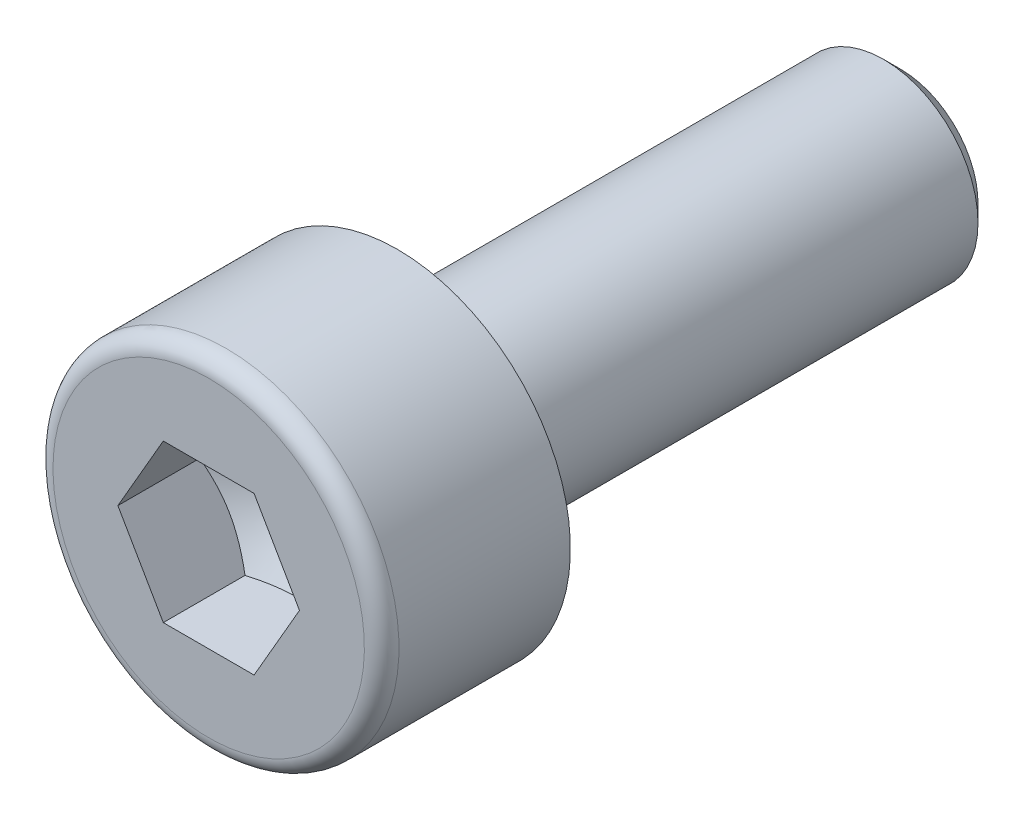
ISO-10303-21;
HEADER;
FILE_DESCRIPTION(('STEP AP214'),'2;1');
FILE_NAME('part.step','',(''),(''),'','','');
FILE_SCHEMA(('AUTOMOTIVE_DESIGN { 1 0 10303 214 1 1 1 1 }'));
ENDSEC;
DATA;
#1=APPLICATION_CONTEXT('core data for automotive mechanical design processes');
#2=APPLICATION_PROTOCOL_DEFINITION('international standard','automotive_design',2000,#1);
#3=PRODUCT_CONTEXT('',#1,'mechanical');
#4=PRODUCT('Part','Part','',(#3));
#5=PRODUCT_RELATED_PRODUCT_CATEGORY('part','',(#4));
#6=PRODUCT_DEFINITION_FORMATION('','',#4);
#7=PRODUCT_DEFINITION_CONTEXT('part definition',#1,'design');
#8=PRODUCT_DEFINITION('design','',#6,#7);
#9=PRODUCT_DEFINITION_SHAPE('','',#8);
#10=(LENGTH_UNIT() NAMED_UNIT(*) SI_UNIT(.MILLI.,.METRE.));
#11=(NAMED_UNIT(*) PLANE_ANGLE_UNIT() SI_UNIT($,.RADIAN.));
#12=(NAMED_UNIT(*) SI_UNIT($,.STERADIAN.) SOLID_ANGLE_UNIT());
#13=UNCERTAINTY_MEASURE_WITH_UNIT(LENGTH_MEASURE(1.E-05),#10,'distance_accuracy_value','');
#14=(GEOMETRIC_REPRESENTATION_CONTEXT(3) GLOBAL_UNCERTAINTY_ASSIGNED_CONTEXT((#13)) GLOBAL_UNIT_ASSIGNED_CONTEXT((#10,
#11,#12)) REPRESENTATION_CONTEXT('',''));
#15=CARTESIAN_POINT('',(0.,0.,0.));
#16=DIRECTION('',(0.,0.,1.));
#17=DIRECTION('',(1.,0.,0.));
#18=AXIS2_PLACEMENT_3D('',#15,#16,#17);
#19=CARTESIAN_POINT('',(0.,1.375,0.));
#20=DIRECTION('',(0.,0.,-1.));
#21=DIRECTION('',(0.,1.,0.));
#22=AXIS2_PLACEMENT_3D('',#19,#20,#21);
#23=PLANE('',#22);
#24=CARTESIAN_POINT('',(0.,0.,0.));
#25=DIRECTION('',(0.,0.,-1.));
#26=DIRECTION('',(0.,1.,0.));
#27=AXIS2_PLACEMENT_3D('',#24,#25,#26);
#28=CIRCLE('',#27,2.75);
#29=CARTESIAN_POINT('',(0.,2.75,0.));
#30=VERTEX_POINT('',#29);
#31=EDGE_CURVE('E11',#30,#30,#28,.T.);
#32=ORIENTED_EDGE('',*,*,#31,.T.);
#33=EDGE_LOOP('',(#32));
#34=FACE_BOUND('',#33,.T.);
#35=CARTESIAN_POINT('',(0.,0.,0.));
#36=DIRECTION('',(0.,0.,1.));
#37=DIRECTION('',(0.,1.,0.));
#38=AXIS2_PLACEMENT_3D('',#35,#36,#37);
#39=CIRCLE('',#38,1.5);
#40=CARTESIAN_POINT('',(0.,-1.5,0.));
#41=VERTEX_POINT('',#40);
#42=EDGE_CURVE('E173',#41,#41,#39,.T.);
#43=ORIENTED_EDGE('',*,*,#42,.T.);
#44=EDGE_LOOP('',(#43));
#45=FACE_BOUND('',#44,.T.);
#46=ADVANCED_FACE('F16',(#34,#45),#23,.T.);
#47=CARTESIAN_POINT('',(0.,0.,1.3625));
#48=DIRECTION('',(0.,0.,1.));
#49=DIRECTION('',(0.,1.,0.));
#50=AXIS2_PLACEMENT_3D('',#47,#48,#49);
#51=CYLINDRICAL_SURFACE('',#50,2.75);
#52=CARTESIAN_POINT('',(0.,0.,2.725));
#53=DIRECTION('',(0.,0.,-1.));
#54=DIRECTION('',(0.,1.,0.));
#55=AXIS2_PLACEMENT_3D('',#52,#53,#54);
#56=CIRCLE('',#55,2.75);
#57=CARTESIAN_POINT('',(0.,2.75,2.725));
#58=VERTEX_POINT('',#57);
#59=EDGE_CURVE('E28',#58,#58,#56,.T.);
#60=ORIENTED_EDGE('',*,*,#59,.T.);
#61=EDGE_LOOP('',(#60));
#62=FACE_BOUND('',#61,.T.);
#63=ORIENTED_EDGE('',*,*,#31,.F.);
#64=EDGE_LOOP('',(#63));
#65=FACE_BOUND('',#64,.T.);
#66=ADVANCED_FACE('F208',(#62,#65),#51,.T.);
#67=CARTESIAN_POINT('',(0.,0.,2.725));
#68=DIRECTION('',(0.,0.,-1.));
#69=DIRECTION('',(-1.,0.,0.));
#70=AXIS2_PLACEMENT_3D('',#67,#68,#69);
#71=TOROIDAL_SURFACE('',#70,2.475,0.275);
#72=CARTESIAN_POINT('',(0.,0.,3.));
#73=DIRECTION('',(0.,0.,-1.));
#74=DIRECTION('',(0.,1.,0.));
#75=AXIS2_PLACEMENT_3D('',#72,#73,#74);
#76=CIRCLE('',#75,2.475);
#77=CARTESIAN_POINT('',(0.,2.475,3.));
#78=VERTEX_POINT('',#77);
#79=EDGE_CURVE('E151',#78,#78,#76,.T.);
#80=ORIENTED_EDGE('',*,*,#79,.T.);
#81=EDGE_LOOP('',(#80));
#82=FACE_BOUND('',#81,.T.);
#83=ORIENTED_EDGE('',*,*,#59,.F.);
#84=EDGE_LOOP('',(#83));
#85=FACE_BOUND('',#84,.T.);
#86=ADVANCED_FACE('F212',(#82,#85),#71,.T.);
#87=CARTESIAN_POINT('',(0.,1.2375,3.));
#88=DIRECTION('',(0.,0.,1.));
#89=DIRECTION('',(0.,-1.,0.));
#90=AXIS2_PLACEMENT_3D('',#87,#88,#89);
#91=PLANE('',#90);
#92=ORIENTED_EDGE('',*,*,#79,.F.);
#93=EDGE_LOOP('',(#92));
#94=FACE_BOUND('',#93,.T.);
#95=DIRECTION('',(-0.5,0.866025403784439,0.));
#96=VECTOR('',#95,1.);
#97=CARTESIAN_POINT('',(-1.35045785929581,-0.160937208593682,3.));
#98=LINE('',#97,#96);
#99=CARTESIAN_POINT('',(-0.7216875,-1.24999941718736,3.));
#100=VERTEX_POINT('',#99);
#101=CARTESIAN_POINT('',(-1.443375,0.,3.));
#102=VERTEX_POINT('',#101);
#103=EDGE_CURVE('E158',#100,#102,#98,.T.);
#104=ORIENTED_EDGE('',*,*,#103,.T.);
#105=DIRECTION('',(0.5,0.866025403784439,0.));
#106=VECTOR('',#105,1.);
#107=CARTESIAN_POINT('',(-0.81460464070419,1.08906220859368,3.));
#108=LINE('',#107,#106);
#109=CARTESIAN_POINT('',(-0.7216875,1.24999941718736,3.));
#110=VERTEX_POINT('',#109);
#111=EDGE_CURVE('E169',#102,#110,#108,.T.);
#112=ORIENTED_EDGE('',*,*,#111,.T.);
#113=DIRECTION('',(1.,0.,0.));
#114=VECTOR('',#113,1.);
#115=CARTESIAN_POINT('',(0.,1.24999941718736,3.));
#116=LINE('',#115,#114);
#117=CARTESIAN_POINT('',(0.7216875,1.24999941718736,3.));
#118=VERTEX_POINT('',#117);
#119=EDGE_CURVE('E156',#110,#118,#116,.T.);
#120=ORIENTED_EDGE('',*,*,#119,.T.);
#121=DIRECTION('',(0.5,-0.866025403784439,0.));
#122=VECTOR('',#121,1.);
#123=CARTESIAN_POINT('',(0.814604640704189,1.08906220859368,3.));
#124=LINE('',#123,#122);
#125=CARTESIAN_POINT('',(1.443375,0.,3.));
#126=VERTEX_POINT('',#125);
#127=EDGE_CURVE('E64',#118,#126,#124,.T.);
#128=ORIENTED_EDGE('',*,*,#127,.T.);
#129=DIRECTION('',(-0.5,-0.866025403784439,0.));
#130=VECTOR('',#129,1.);
#131=CARTESIAN_POINT('',(1.35045785929581,-0.160937208593682,3.));
#132=LINE('',#131,#130);
#133=CARTESIAN_POINT('',(0.7216875,-1.24999941718736,3.));
#134=VERTEX_POINT('',#133);
#135=EDGE_CURVE('E70',#126,#134,#132,.T.);
#136=ORIENTED_EDGE('',*,*,#135,.T.);
#137=DIRECTION('',(-1.,0.,0.));
#138=VECTOR('',#137,1.);
#139=CARTESIAN_POINT('',(0.,-1.24999941718736,3.));
#140=LINE('',#139,#138);
#141=EDGE_CURVE('E99',#134,#100,#140,.T.);
#142=ORIENTED_EDGE('',*,*,#141,.T.);
#143=EDGE_LOOP('',(#104,#112,#120,#128,#136,#142));
#144=FACE_BOUND('',#143,.T.);
#145=ADVANCED_FACE('F194',(#94,#144),#91,.T.);
#146=CARTESIAN_POINT('',(0.,0.6146875,-8.));
#147=DIRECTION('',(0.,0.,-1.));
#148=DIRECTION('',(0.,1.,0.));
#149=AXIS2_PLACEMENT_3D('',#146,#147,#148);
#150=PLANE('',#149);
#151=CARTESIAN_POINT('',(0.,0.,-8.));
#152=DIRECTION('',(0.,0.,-1.));
#153=DIRECTION('',(0.,1.,0.));
#154=AXIS2_PLACEMENT_3D('',#151,#152,#153);
#155=CIRCLE('',#154,1.229375);
#156=CARTESIAN_POINT('',(0.,1.229375,-8.));
#157=VERTEX_POINT('',#156);
#158=EDGE_CURVE('E146',#157,#157,#155,.T.);
#159=ORIENTED_EDGE('',*,*,#158,.T.);
#160=EDGE_LOOP('',(#159));
#161=FACE_BOUND('',#160,.T.);
#162=ADVANCED_FACE('F225',(#161),#150,.T.);
#163=CARTESIAN_POINT('',(0.,0.,-7.8646875));
#164=DIRECTION('',(0.,0.,1.));
#165=DIRECTION('',(0.,1.,0.));
#166=AXIS2_PLACEMENT_3D('',#163,#164,#165);
#167=CONICAL_SURFACE('',#166,1.3646875,0.785398163397448);
#168=CARTESIAN_POINT('',(0.,0.,-7.729375));
#169=DIRECTION('',(0.,0.,-1.));
#170=DIRECTION('',(0.,1.,0.));
#171=AXIS2_PLACEMENT_3D('',#168,#169,#170);
#172=CIRCLE('',#171,1.5);
#173=CARTESIAN_POINT('',(0.,1.5,-7.729375));
#174=VERTEX_POINT('',#173);
#175=EDGE_CURVE('E125',#174,#174,#172,.T.);
#176=ORIENTED_EDGE('',*,*,#175,.T.);
#177=EDGE_LOOP('',(#176));
#178=FACE_BOUND('',#177,.T.);
#179=ORIENTED_EDGE('',*,*,#158,.F.);
#180=EDGE_LOOP('',(#179));
#181=FACE_BOUND('',#180,.T.);
#182=ADVANCED_FACE('F204',(#178,#181),#167,.T.);
#183=CARTESIAN_POINT('',(0.,0.,-3.3646875));
#184=DIRECTION('',(0.,0.,1.));
#185=DIRECTION('',(0.,1.,0.));
#186=AXIS2_PLACEMENT_3D('',#183,#184,#185);
#187=CYLINDRICAL_SURFACE('',#186,1.5);
#188=ORIENTED_EDGE('',*,*,#42,.F.);
#189=EDGE_LOOP('',(#188));
#190=FACE_BOUND('',#189,.T.);
#191=ORIENTED_EDGE('',*,*,#175,.F.);
#192=EDGE_LOOP('',(#191));
#193=FACE_BOUND('',#192,.T.);
#194=ADVANCED_FACE('F18',(#190,#193),#187,.T.);
#195=CARTESIAN_POINT('',(-1.08253125,0.624999708593682,3.));
#196=DIRECTION('',(-0.866025403784439,0.5,0.));
#197=DIRECTION('',(0.5,0.866025403784439,0.));
#198=AXIS2_PLACEMENT_3D('',#195,#196,#197);
#199=PLANE('',#198);
#200=CARTESIAN_POINT('',(-1.443375,0.,1.7));
#201=CARTESIAN_POINT('',(-1.08253125,0.62499970859368,1.49166676380211));
#202=CARTESIAN_POINT('',(-0.7216875,1.24999941718736,1.7));
#203=(BOUNDED_CURVE() B_SPLINE_CURVE(2,(#200,#201,#202),.UNSPECIFIED.,.F.,
.F.) B_SPLINE_CURVE_WITH_KNOTS((3,3),(0.,1.46054449161806),
.UNSPECIFIED.) CURVE() GEOMETRIC_REPRESENTATION_ITEM() RATIONAL_B_SPLINE_CURVE((1.,
1.15470053837926,1.)) REPRESENTATION_ITEM(''));
#204=CARTESIAN_POINT('',(-1.443375,0.,1.7));
#205=VERTEX_POINT('',#204);
#206=CARTESIAN_POINT('',(-0.7216875,1.24999941718736,1.7));
#207=VERTEX_POINT('',#206);
#208=EDGE_CURVE('E115',#205,#207,#203,.T.);
#209=ORIENTED_EDGE('',*,*,#208,.T.);
#210=DIRECTION('',(0.,0.,-1.));
#211=VECTOR('',#210,1.);
#212=CARTESIAN_POINT('',(-0.7216875,1.24999941718736,3.));
#213=LINE('',#212,#211);
#214=EDGE_CURVE('E170',#110,#207,#213,.T.);
#215=ORIENTED_EDGE('',*,*,#214,.F.);
#216=ORIENTED_EDGE('',*,*,#111,.F.);
#217=DIRECTION('',(0.,0.,-1.));
#218=VECTOR('',#217,1.);
#219=CARTESIAN_POINT('',(-1.443375,0.,3.));
#220=LINE('',#219,#218);
#221=EDGE_CURVE('E109',#102,#205,#220,.T.);
#222=ORIENTED_EDGE('',*,*,#221,.T.);
#223=EDGE_LOOP('',(#209,#215,#216,#222));
#224=FACE_BOUND('',#223,.T.);
#225=ADVANCED_FACE('F195',(#224),#199,.F.);
#226=CARTESIAN_POINT('',(0.,1.24999941718736,3.));
#227=DIRECTION('',(0.,1.,0.));
#228=DIRECTION('',(1.,0.,0.));
#229=AXIS2_PLACEMENT_3D('',#226,#227,#228);
#230=PLANE('',#229);
#231=CARTESIAN_POINT('',(-0.7216875,1.24999941718736,1.7));
#232=CARTESIAN_POINT('',(0.,1.24999941718737,1.4916667638021));
#233=CARTESIAN_POINT('',(0.7216875,1.24999941718736,1.7));
#234=(BOUNDED_CURVE() B_SPLINE_CURVE(2,(#231,#232,#233),.UNSPECIFIED.,.F.,
.F.) B_SPLINE_CURVE_WITH_KNOTS((3,3),(0.,1.46054449161806),
.UNSPECIFIED.) CURVE() GEOMETRIC_REPRESENTATION_ITEM() RATIONAL_B_SPLINE_CURVE((1.,
1.15470053837925,1.)) REPRESENTATION_ITEM(''));
#235=CARTESIAN_POINT('',(0.7216875,1.24999941718736,1.7));
#236=VERTEX_POINT('',#235);
#237=EDGE_CURVE('E120',#207,#236,#234,.T.);
#238=ORIENTED_EDGE('',*,*,#237,.T.);
#239=DIRECTION('',(0.,0.,-1.));
#240=VECTOR('',#239,1.);
#241=CARTESIAN_POINT('',(0.7216875,1.24999941718736,3.));
#242=LINE('',#241,#240);
#243=EDGE_CURVE('E153',#118,#236,#242,.T.);
#244=ORIENTED_EDGE('',*,*,#243,.F.);
#245=ORIENTED_EDGE('',*,*,#119,.F.);
#246=ORIENTED_EDGE('',*,*,#214,.T.);
#247=EDGE_LOOP('',(#238,#244,#245,#246));
#248=FACE_BOUND('',#247,.T.);
#249=ADVANCED_FACE('F193',(#248),#230,.F.);
#250=CARTESIAN_POINT('',(1.08253125,0.624999708593682,3.));
#251=DIRECTION('',(0.866025403784439,0.5,0.));
#252=DIRECTION('',(0.5,-0.866025403784439,0.));
#253=AXIS2_PLACEMENT_3D('',#250,#251,#252);
#254=PLANE('',#253);
#255=CARTESIAN_POINT('',(0.7216875,1.24999941718737,1.7));
#256=CARTESIAN_POINT('',(1.08253125,0.624999708593683,1.49166676380211));
#257=CARTESIAN_POINT('',(1.443375,0.,1.7));
#258=(BOUNDED_CURVE() B_SPLINE_CURVE(2,(#255,#256,#257),.UNSPECIFIED.,.F.,
.F.) B_SPLINE_CURVE_WITH_KNOTS((3,3),(0.,1.46054449161806),
.UNSPECIFIED.) CURVE() GEOMETRIC_REPRESENTATION_ITEM() RATIONAL_B_SPLINE_CURVE((1.,
1.15470053837925,1.)) REPRESENTATION_ITEM(''));
#259=CARTESIAN_POINT('',(1.443375,0.,1.7));
#260=VERTEX_POINT('',#259);
#261=EDGE_CURVE('E127',#236,#260,#258,.T.);
#262=ORIENTED_EDGE('',*,*,#261,.T.);
#263=DIRECTION('',(0.,0.,-1.));
#264=VECTOR('',#263,1.);
#265=CARTESIAN_POINT('',(1.443375,0.,3.));
#266=LINE('',#265,#264);
#267=EDGE_CURVE('E105',#126,#260,#266,.T.);
#268=ORIENTED_EDGE('',*,*,#267,.F.);
#269=ORIENTED_EDGE('',*,*,#127,.F.);
#270=ORIENTED_EDGE('',*,*,#243,.T.);
#271=EDGE_LOOP('',(#262,#268,#269,#270));
#272=FACE_BOUND('',#271,.T.);
#273=ADVANCED_FACE('F192',(#272),#254,.F.);
#274=CARTESIAN_POINT('',(1.08253125,-0.624999708593682,3.));
#275=DIRECTION('',(0.866025403784439,-0.5,0.));
#276=DIRECTION('',(-0.5,-0.866025403784439,0.));
#277=AXIS2_PLACEMENT_3D('',#274,#275,#276);
#278=PLANE('',#277);
#279=CARTESIAN_POINT('',(1.443375,0.,1.7));
#280=CARTESIAN_POINT('',(1.08253125,-0.624999708593683,1.49166676380211));
#281=CARTESIAN_POINT('',(0.7216875,-1.24999941718737,1.7));
#282=(BOUNDED_CURVE() B_SPLINE_CURVE(2,(#279,#280,#281),.UNSPECIFIED.,.F.,
.F.) B_SPLINE_CURVE_WITH_KNOTS((3,3),(0.,1.46054449161806),
.UNSPECIFIED.) CURVE() GEOMETRIC_REPRESENTATION_ITEM() RATIONAL_B_SPLINE_CURVE((1.,
1.15470053837925,1.)) REPRESENTATION_ITEM(''));
#283=CARTESIAN_POINT('',(0.7216875,-1.24999941718736,1.7));
#284=VERTEX_POINT('',#283);
#285=EDGE_CURVE('E103',#260,#284,#282,.T.);
#286=ORIENTED_EDGE('',*,*,#285,.T.);
#287=DIRECTION('',(0.,0.,-1.));
#288=VECTOR('',#287,1.);
#289=CARTESIAN_POINT('',(0.7216875,-1.24999941718736,3.));
#290=LINE('',#289,#288);
#291=EDGE_CURVE('E93',#134,#284,#290,.T.);
#292=ORIENTED_EDGE('',*,*,#291,.F.);
#293=ORIENTED_EDGE('',*,*,#135,.F.);
#294=ORIENTED_EDGE('',*,*,#267,.T.);
#295=EDGE_LOOP('',(#286,#292,#293,#294));
#296=FACE_BOUND('',#295,.T.);
#297=ADVANCED_FACE('F104',(#296),#278,.F.);
#298=CARTESIAN_POINT('',(0.,-1.24999941718736,3.));
#299=DIRECTION('',(0.,-1.,0.));
#300=DIRECTION('',(-1.,0.,0.));
#301=AXIS2_PLACEMENT_3D('',#298,#299,#300);
#302=PLANE('',#301);
#303=CARTESIAN_POINT('',(0.7216875,-1.24999941718736,1.7));
#304=CARTESIAN_POINT('',(0.,-1.24999941718736,1.4916667638021));
#305=CARTESIAN_POINT('',(-0.7216875,-1.24999941718736,1.7));
#306=(BOUNDED_CURVE() B_SPLINE_CURVE(2,(#303,#304,#305),.UNSPECIFIED.,.F.,
.F.) B_SPLINE_CURVE_WITH_KNOTS((3,3),(0.,1.46054449161806),
.UNSPECIFIED.) CURVE() GEOMETRIC_REPRESENTATION_ITEM() RATIONAL_B_SPLINE_CURVE((1.,
1.15470053837925,1.)) REPRESENTATION_ITEM(''));
#307=CARTESIAN_POINT('',(-0.7216875,-1.24999941718736,1.7));
#308=VERTEX_POINT('',#307);
#309=EDGE_CURVE('E20',#284,#308,#306,.T.);
#310=ORIENTED_EDGE('',*,*,#309,.T.);
#311=DIRECTION('',(0.,0.,-1.));
#312=VECTOR('',#311,1.);
#313=CARTESIAN_POINT('',(-0.7216875,-1.24999941718736,3.));
#314=LINE('',#313,#312);
#315=EDGE_CURVE('E161',#100,#308,#314,.T.);
#316=ORIENTED_EDGE('',*,*,#315,.F.);
#317=ORIENTED_EDGE('',*,*,#141,.F.);
#318=ORIENTED_EDGE('',*,*,#291,.T.);
#319=EDGE_LOOP('',(#310,#316,#317,#318));
#320=FACE_BOUND('',#319,.T.);
#321=ADVANCED_FACE('F95',(#320),#302,.F.);
#322=CARTESIAN_POINT('',(-1.08253125,-0.624999708593682,3.));
#323=DIRECTION('',(-0.866025403784439,-0.5,0.));
#324=DIRECTION('',(-0.5,0.866025403784439,0.));
#325=AXIS2_PLACEMENT_3D('',#322,#323,#324);
#326=PLANE('',#325);
#327=CARTESIAN_POINT('',(-0.7216875,-1.24999941718737,1.7));
#328=CARTESIAN_POINT('',(-1.08253125,-0.624999708593682,1.4916667638021));
#329=CARTESIAN_POINT('',(-1.443375,0.,1.7));
#330=(BOUNDED_CURVE() B_SPLINE_CURVE(2,(#327,#328,#329),.UNSPECIFIED.,.F.,
.F.) B_SPLINE_CURVE_WITH_KNOTS((3,3),(0.,1.46054449161806),
.UNSPECIFIED.) CURVE() GEOMETRIC_REPRESENTATION_ITEM() RATIONAL_B_SPLINE_CURVE((1.,
1.15470053837925,1.)) REPRESENTATION_ITEM(''));
#331=EDGE_CURVE('E114',#308,#205,#330,.T.);
#332=ORIENTED_EDGE('',*,*,#331,.T.);
#333=ORIENTED_EDGE('',*,*,#221,.F.);
#334=ORIENTED_EDGE('',*,*,#103,.F.);
#335=ORIENTED_EDGE('',*,*,#315,.T.);
#336=EDGE_LOOP('',(#332,#333,#334,#335));
#337=FACE_BOUND('',#336,.T.);
#338=ADVANCED_FACE('F220',(#337),#326,.F.);
#339=CARTESIAN_POINT('',(0.,0.,1.28333352760421));
#340=DIRECTION('',(0.,0.,1.));
#341=DIRECTION('',(0.,1.,0.));
#342=AXIS2_PLACEMENT_3D('',#339,#340,#341);
#343=CONICAL_SURFACE('',#342,0.7216875,1.0471975511966);
#344=CARTESIAN_POINT('',(0.,0.,0.866667055208424));
#345=VERTEX_POINT('',#344);
#346=VERTEX_LOOP('',#345);
#347=FACE_BOUND('',#346,.T.);
#348=ORIENTED_EDGE('',*,*,#261,.F.);
#349=ORIENTED_EDGE('',*,*,#237,.F.);
#350=ORIENTED_EDGE('',*,*,#208,.F.);
#351=ORIENTED_EDGE('',*,*,#331,.F.);
#352=ORIENTED_EDGE('',*,*,#309,.F.);
#353=ORIENTED_EDGE('',*,*,#285,.F.);
#354=EDGE_LOOP('',(#348,#349,#350,#351,#352,#353));
#355=FACE_BOUND('',#354,.T.);
#356=ADVANCED_FACE('F111',(#347,#355),#343,.F.);
#357=CLOSED_SHELL('',(#46,#66,#86,#145,#162,#182,#194,#225,#249,#273,#297,#321,#338,#356));
#358=MANIFOLD_SOLID_BREP('B1',#357);
#359=ADVANCED_BREP_SHAPE_REPRESENTATION('',(#18,#358),#14);
#360=SHAPE_DEFINITION_REPRESENTATION(#9,#359);
ENDSEC;
END-ISO-10303-21;
